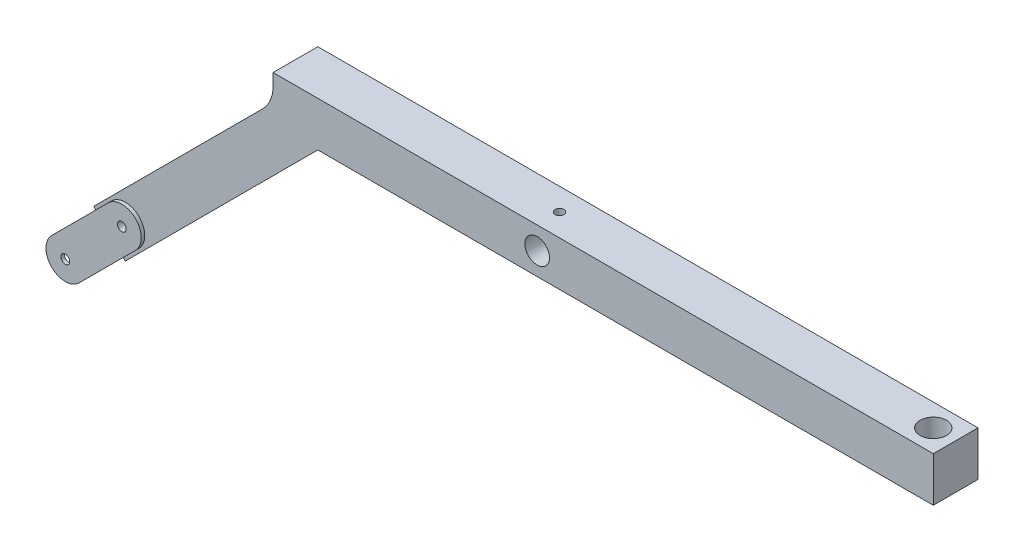
ISO-10303-21;
HEADER;
FILE_DESCRIPTION(('STEP AP214'),'2;1');
FILE_NAME('part.step','',(''),(''),'','','');
FILE_SCHEMA(('AUTOMOTIVE_DESIGN { 1 0 10303 214 1 1 1 1 }'));
ENDSEC;
DATA;
#1=APPLICATION_CONTEXT('core data for automotive mechanical design processes');
#2=APPLICATION_PROTOCOL_DEFINITION('international standard','automotive_design',2000,#1);
#3=PRODUCT_CONTEXT('',#1,'mechanical');
#4=PRODUCT('Part','Part','',(#3));
#5=PRODUCT_RELATED_PRODUCT_CATEGORY('part','',(#4));
#6=PRODUCT_DEFINITION_FORMATION('','',#4);
#7=PRODUCT_DEFINITION_CONTEXT('part definition',#1,'design');
#8=PRODUCT_DEFINITION('design','',#6,#7);
#9=PRODUCT_DEFINITION_SHAPE('','',#8);
#10=(LENGTH_UNIT() NAMED_UNIT(*) SI_UNIT(.MILLI.,.METRE.));
#11=(NAMED_UNIT(*) PLANE_ANGLE_UNIT() SI_UNIT($,.RADIAN.));
#12=(NAMED_UNIT(*) SI_UNIT($,.STERADIAN.) SOLID_ANGLE_UNIT());
#13=UNCERTAINTY_MEASURE_WITH_UNIT(LENGTH_MEASURE(1.E-05),#10,'distance_accuracy_value','');
#14=(GEOMETRIC_REPRESENTATION_CONTEXT(3) GLOBAL_UNCERTAINTY_ASSIGNED_CONTEXT((#13)) GLOBAL_UNIT_ASSIGNED_CONTEXT((#10,
#11,#12)) REPRESENTATION_CONTEXT('',''));
#15=CARTESIAN_POINT('',(0.,0.,0.));
#16=DIRECTION('',(0.,0.,1.));
#17=DIRECTION('',(1.,0.,0.));
#18=AXIS2_PLACEMENT_3D('',#15,#16,#17);
#19=CARTESIAN_POINT('',(-100.,0.,140.));
#20=DIRECTION('',(0.,0.,-1.));
#21=DIRECTION('',(-1.,0.,0.));
#22=AXIS2_PLACEMENT_3D('',#19,#20,#21);
#23=PLANE('',#22);
#24=DIRECTION('',(1.,0.,0.));
#25=VECTOR('',#24,1.);
#26=CARTESIAN_POINT('',(-100.,133.1,140.));
#27=LINE('',#26,#25);
#28=CARTESIAN_POINT('',(-100.,133.1,140.));
#29=VERTEX_POINT('',#28);
#30=CARTESIAN_POINT('',(275.,133.1,140.));
#31=VERTEX_POINT('',#30);
#32=EDGE_CURVE('E391',#29,#31,#27,.T.);
#33=ORIENTED_EDGE('',*,*,#32,.T.);
#34=DIRECTION('',(0.,1.,0.));
#35=VECTOR('',#34,1.);
#36=CARTESIAN_POINT('',(275.,133.1,140.));
#37=LINE('',#36,#35);
#38=CARTESIAN_POINT('',(275.,107.7,140.));
#39=VERTEX_POINT('',#38);
#40=EDGE_CURVE('E191',#39,#31,#37,.T.);
#41=ORIENTED_EDGE('',*,*,#40,.F.);
#42=DIRECTION('',(1.,0.,0.));
#43=VECTOR('',#42,1.);
#44=CARTESIAN_POINT('',(-100.,107.7,140.));
#45=LINE('',#44,#43);
#46=CARTESIAN_POINT('',(-74.6,107.7,140.));
#47=VERTEX_POINT('',#46);
#48=EDGE_CURVE('E186',#47,#39,#45,.T.);
#49=ORIENTED_EDGE('',*,*,#48,.F.);
#50=DIRECTION('',(0.707106781186547,0.707106781186548,0.));
#51=VECTOR('',#50,1.);
#52=CARTESIAN_POINT('',(-183.91870837144,-1.61870837144028,140.));
#53=LINE('',#52,#51);
#54=CARTESIAN_POINT('',(-183.91870837144,-1.61870837144028,140.));
#55=VERTEX_POINT('',#54);
#56=EDGE_CURVE('E346',#55,#47,#53,.T.);
#57=ORIENTED_EDGE('',*,*,#56,.F.);
#58=DIRECTION('',(0.707106781186547,-0.707106781186548,0.));
#59=VECTOR('',#58,1.);
#60=CARTESIAN_POINT('',(-183.91870837144,-1.61870837144028,140.));
#61=LINE('',#60,#59);
#62=CARTESIAN_POINT('',(-185.120789899457,-0.416626843423315,140.));
#63=VERTEX_POINT('',#62);
#64=EDGE_CURVE('E341',#63,#55,#61,.T.);
#65=ORIENTED_EDGE('',*,*,#64,.F.);
#66=DIRECTION('',(0.707106781186548,0.707106781186548,0.));
#67=VECTOR('',#66,1.);
#68=CARTESIAN_POINT('',(-176.140533778388,8.56362927764567,140.));
#69=LINE('',#68,#67);
#70=CARTESIAN_POINT('',(-176.140533778388,8.56362927764567,140.));
#71=VERTEX_POINT('',#70);
#72=EDGE_CURVE('E249',#63,#71,#69,.T.);
#73=ORIENTED_EDGE('',*,*,#72,.T.);
#74=CARTESIAN_POINT('',(-183.91870837144,16.3418038706977,140.));
#75=DIRECTION('',(0.,0.,1.));
#76=DIRECTION('',(1.,0.,0.));
#77=AXIS2_PLACEMENT_3D('',#74,#75,#76);
#78=CIRCLE('',#77,11.);
#79=CARTESIAN_POINT('',(-191.696882964492,24.1199784637497,140.));
#80=VERTEX_POINT('',#79);
#81=EDGE_CURVE('E222',#71,#80,#78,.T.);
#82=ORIENTED_EDGE('',*,*,#81,.T.);
#83=DIRECTION('',(-0.707106781186548,-0.707106781186548,0.));
#84=VECTOR('',#83,1.);
#85=CARTESIAN_POINT('',(-191.696882964492,24.1199784637497,140.));
#86=LINE('',#85,#84);
#87=CARTESIAN_POINT('',(-200.677139085561,15.1397223426807,140.));
#88=VERTEX_POINT('',#87);
#89=EDGE_CURVE('E228',#80,#88,#86,.T.);
#90=ORIENTED_EDGE('',*,*,#89,.T.);
#91=CARTESIAN_POINT('',(-201.879220613578,16.3418038706977,140.));
#92=VERTEX_POINT('',#91);
#93=EDGE_CURVE('E342',#92,#88,#61,.T.);
#94=ORIENTED_EDGE('',*,*,#93,.F.);
#95=DIRECTION('',(0.707106781186547,0.707106781186548,0.));
#96=VECTOR('',#95,1.);
#97=CARTESIAN_POINT('',(-201.879220613578,16.3418038706977,140.));
#98=LINE('',#97,#96);
#99=CARTESIAN_POINT('',(-105.857864376269,112.363160108007,140.));
#100=VERTEX_POINT('',#99);
#101=EDGE_CURVE('E352',#92,#100,#98,.T.);
#102=ORIENTED_EDGE('',*,*,#101,.T.);
#103=CARTESIAN_POINT('',(-120.,126.505295731738,140.));
#104=DIRECTION('',(0.,0.,-1.));
#105=DIRECTION('',(-1.,0.,0.));
#106=AXIS2_PLACEMENT_3D('',#103,#104,#105);
#107=CIRCLE('',#106,20.);
#108=CARTESIAN_POINT('',(-100.,126.505295731738,140.));
#109=VERTEX_POINT('',#108);
#110=EDGE_CURVE('E52',#100,#109,#107,.F.);
#111=ORIENTED_EDGE('',*,*,#110,.T.);
#112=DIRECTION('',(0.,1.,0.));
#113=VECTOR('',#112,1.);
#114=CARTESIAN_POINT('',(-100.,0.,140.));
#115=LINE('',#114,#113);
#116=EDGE_CURVE('E374',#109,#29,#115,.T.);
#117=ORIENTED_EDGE('',*,*,#116,.T.);
#118=EDGE_LOOP('',(#33,#41,#49,#57,#65,#73,#82,#90,#94,#102,#111,#117));
#119=FACE_BOUND('',#118,.T.);
#120=CARTESIAN_POINT('',(49.9999999999997,120.4,140.));
#121=DIRECTION('',(0.,0.,-1.));
#122=DIRECTION('',(-1.,0.,0.));
#123=AXIS2_PLACEMENT_3D('',#120,#121,#122);
#124=CIRCLE('',#123,7.);
#125=CARTESIAN_POINT('',(42.9999999999997,120.4,140.));
#126=VERTEX_POINT('',#125);
#127=EDGE_CURVE('E375',#126,#126,#124,.F.);
#128=ORIENTED_EDGE('',*,*,#127,.T.);
#129=EDGE_LOOP('',(#128));
#130=FACE_BOUND('',#129,.T.);
#131=ADVANCED_FACE('F43',(#119,#130),#23,.T.);
#132=CARTESIAN_POINT('',(-100.,0.,165.4));
#133=DIRECTION('',(0.,0.,-1.));
#134=DIRECTION('',(-1.,0.,0.));
#135=AXIS2_PLACEMENT_3D('',#132,#133,#134);
#136=PLANE('',#135);
#137=CARTESIAN_POINT('',(49.9999999999997,120.4,165.4));
#138=DIRECTION('',(0.,0.,1.));
#139=DIRECTION('',(1.,0.,0.));
#140=AXIS2_PLACEMENT_3D('',#137,#138,#139);
#141=CIRCLE('',#140,7.);
#142=CARTESIAN_POINT('',(56.9999999999997,120.4,165.4));
#143=VERTEX_POINT('',#142);
#144=EDGE_CURVE('E370',#143,#143,#141,.T.);
#145=ORIENTED_EDGE('',*,*,#144,.F.);
#146=EDGE_LOOP('',(#145));
#147=FACE_BOUND('',#146,.T.);
#148=DIRECTION('',(1.,0.,0.));
#149=VECTOR('',#148,1.);
#150=CARTESIAN_POINT('',(-100.,107.7,165.4));
#151=LINE('',#150,#149);
#152=CARTESIAN_POINT('',(-74.6,107.7,165.4));
#153=VERTEX_POINT('',#152);
#154=CARTESIAN_POINT('',(275.,107.7,165.4));
#155=VERTEX_POINT('',#154);
#156=EDGE_CURVE('E167',#153,#155,#151,.T.);
#157=ORIENTED_EDGE('',*,*,#156,.T.);
#158=DIRECTION('',(0.,-1.,0.));
#159=VECTOR('',#158,1.);
#160=CARTESIAN_POINT('',(275.,133.1,165.4));
#161=LINE('',#160,#159);
#162=CARTESIAN_POINT('',(275.,133.1,165.4));
#163=VERTEX_POINT('',#162);
#164=EDGE_CURVE('E172',#163,#155,#161,.T.);
#165=ORIENTED_EDGE('',*,*,#164,.F.);
#166=DIRECTION('',(1.,0.,0.));
#167=VECTOR('',#166,1.);
#168=CARTESIAN_POINT('',(-100.,133.1,165.4));
#169=LINE('',#168,#167);
#170=CARTESIAN_POINT('',(-100.,133.1,165.4));
#171=VERTEX_POINT('',#170);
#172=EDGE_CURVE('E180',#171,#163,#169,.T.);
#173=ORIENTED_EDGE('',*,*,#172,.F.);
#174=DIRECTION('',(0.,1.,0.));
#175=VECTOR('',#174,1.);
#176=CARTESIAN_POINT('',(-100.,0.,165.4));
#177=LINE('',#176,#175);
#178=CARTESIAN_POINT('',(-100.,126.505295731738,165.4));
#179=VERTEX_POINT('',#178);
#180=EDGE_CURVE('E386',#179,#171,#177,.T.);
#181=ORIENTED_EDGE('',*,*,#180,.F.);
#182=CARTESIAN_POINT('',(-120.,126.505295731738,165.4));
#183=DIRECTION('',(0.,0.,-1.));
#184=DIRECTION('',(-1.,0.,0.));
#185=AXIS2_PLACEMENT_3D('',#182,#183,#184);
#186=CIRCLE('',#185,20.);
#187=CARTESIAN_POINT('',(-105.857864376269,112.363160108007,165.4));
#188=VERTEX_POINT('',#187);
#189=EDGE_CURVE('E11',#179,#188,#186,.T.);
#190=ORIENTED_EDGE('',*,*,#189,.T.);
#191=DIRECTION('',(0.707106781186547,0.707106781186548,0.));
#192=VECTOR('',#191,1.);
#193=CARTESIAN_POINT('',(-201.879220613578,16.3418038706977,165.4));
#194=LINE('',#193,#192);
#195=CARTESIAN_POINT('',(-201.879220613578,16.3418038706977,165.4));
#196=VERTEX_POINT('',#195);
#197=EDGE_CURVE('E355',#196,#188,#194,.T.);
#198=ORIENTED_EDGE('',*,*,#197,.F.);
#199=DIRECTION('',(-0.707106781186547,0.707106781186548,0.));
#200=VECTOR('',#199,1.);
#201=CARTESIAN_POINT('',(-183.91870837144,-1.61870837144028,165.4));
#202=LINE('',#201,#200);
#203=CARTESIAN_POINT('',(-200.677139085561,15.1397223426807,165.4));
#204=VERTEX_POINT('',#203);
#205=EDGE_CURVE('E332',#204,#196,#202,.T.);
#206=ORIENTED_EDGE('',*,*,#205,.F.);
#207=DIRECTION('',(-0.707106781186548,-0.707106781186548,0.));
#208=VECTOR('',#207,1.);
#209=CARTESIAN_POINT('',(-191.696882964492,24.1199784637497,165.4));
#210=LINE('',#209,#208);
#211=CARTESIAN_POINT('',(-191.696882964492,24.1199784637497,165.4));
#212=VERTEX_POINT('',#211);
#213=EDGE_CURVE('E302',#212,#204,#210,.T.);
#214=ORIENTED_EDGE('',*,*,#213,.F.);
#215=CARTESIAN_POINT('',(-183.91870837144,16.3418038706977,165.4));
#216=DIRECTION('',(0.,0.,1.));
#217=DIRECTION('',(1.,0.,0.));
#218=AXIS2_PLACEMENT_3D('',#215,#216,#217);
#219=CIRCLE('',#218,11.);
#220=CARTESIAN_POINT('',(-176.140533778388,8.56362927764567,165.4));
#221=VERTEX_POINT('',#220);
#222=EDGE_CURVE('E282',#221,#212,#219,.T.);
#223=ORIENTED_EDGE('',*,*,#222,.F.);
#224=DIRECTION('',(0.707106781186548,0.707106781186548,0.));
#225=VECTOR('',#224,1.);
#226=CARTESIAN_POINT('',(-176.140533778388,8.56362927764567,165.4));
#227=LINE('',#226,#225);
#228=CARTESIAN_POINT('',(-185.120789899457,-0.416626843423316,165.4));
#229=VERTEX_POINT('',#228);
#230=EDGE_CURVE('E179',#229,#221,#227,.T.);
#231=ORIENTED_EDGE('',*,*,#230,.F.);
#232=CARTESIAN_POINT('',(-183.91870837144,-1.61870837144028,165.4));
#233=VERTEX_POINT('',#232);
#234=EDGE_CURVE('E333',#233,#229,#202,.T.);
#235=ORIENTED_EDGE('',*,*,#234,.F.);
#236=DIRECTION('',(0.707106781186547,0.707106781186548,0.));
#237=VECTOR('',#236,1.);
#238=CARTESIAN_POINT('',(-183.91870837144,-1.61870837144028,165.4));
#239=LINE('',#238,#237);
#240=EDGE_CURVE('E174',#233,#153,#239,.T.);
#241=ORIENTED_EDGE('',*,*,#240,.T.);
#242=EDGE_LOOP('',(#157,#165,#173,#181,#190,#198,#206,#214,#223,#231,#235,#241));
#243=FACE_BOUND('',#242,.T.);
#244=ADVANCED_FACE('F169',(#147,#243),#136,.F.);
#245=CARTESIAN_POINT('',(-100.,107.7,0.));
#246=DIRECTION('',(0.,-1.,0.));
#247=DIRECTION('',(0.,0.,-1.));
#248=AXIS2_PLACEMENT_3D('',#245,#246,#247);
#249=PLANE('',#248);
#250=CARTESIAN_POINT('',(262.3,107.7,152.7));
#251=DIRECTION('',(0.,-1.,0.));
#252=DIRECTION('',(0.,0.,-1.));
#253=AXIS2_PLACEMENT_3D('',#250,#251,#252);
#254=CIRCLE('',#253,7.50000000000001);
#255=CARTESIAN_POINT('',(262.3,107.7,145.2));
#256=VERTEX_POINT('',#255);
#257=EDGE_CURVE('E202',#256,#256,#254,.F.);
#258=ORIENTED_EDGE('',*,*,#257,.T.);
#259=EDGE_LOOP('',(#258));
#260=FACE_BOUND('',#259,.T.);
#261=CARTESIAN_POINT('',(50.,107.7,152.7));
#262=DIRECTION('',(0.,1.,0.));
#263=DIRECTION('',(0.,0.,1.));
#264=AXIS2_PLACEMENT_3D('',#261,#262,#263);
#265=CIRCLE('',#264,2.5);
#266=CARTESIAN_POINT('',(50.,107.7,155.2));
#267=VERTEX_POINT('',#266);
#268=EDGE_CURVE('E362',#267,#267,#265,.T.);
#269=ORIENTED_EDGE('',*,*,#268,.T.);
#270=EDGE_LOOP('',(#269));
#271=FACE_BOUND('',#270,.T.);
#272=ORIENTED_EDGE('',*,*,#48,.T.);
#273=DIRECTION('',(0.,0.,-1.));
#274=VECTOR('',#273,1.);
#275=CARTESIAN_POINT('',(275.,107.7,165.4));
#276=LINE('',#275,#274);
#277=EDGE_CURVE('E183',#155,#39,#276,.T.);
#278=ORIENTED_EDGE('',*,*,#277,.F.);
#279=ORIENTED_EDGE('',*,*,#156,.F.);
#280=DIRECTION('',(0.,0.,1.));
#281=VECTOR('',#280,1.);
#282=CARTESIAN_POINT('',(-74.6,107.7,140.));
#283=LINE('',#282,#281);
#284=EDGE_CURVE('E327',#47,#153,#283,.T.);
#285=ORIENTED_EDGE('',*,*,#284,.F.);
#286=EDGE_LOOP('',(#272,#278,#279,#285));
#287=FACE_BOUND('',#286,.T.);
#288=ADVANCED_FACE('F184',(#260,#271,#287),#249,.T.);
#289=CARTESIAN_POINT('',(-100.,0.,0.));
#290=DIRECTION('',(1.,0.,0.));
#291=DIRECTION('',(0.,0.,-1.));
#292=AXIS2_PLACEMENT_3D('',#289,#290,#291);
#293=PLANE('',#292);
#294=ORIENTED_EDGE('',*,*,#116,.F.);
#295=DIRECTION('',(0.,0.,-1.));
#296=VECTOR('',#295,1.);
#297=CARTESIAN_POINT('',(-100.,126.505295731738,165.4));
#298=LINE('',#297,#296);
#299=EDGE_CURVE('E65',#109,#179,#298,.F.);
#300=ORIENTED_EDGE('',*,*,#299,.T.);
#301=ORIENTED_EDGE('',*,*,#180,.T.);
#302=DIRECTION('',(0.,0.,-1.));
#303=VECTOR('',#302,1.);
#304=CARTESIAN_POINT('',(-100.,133.1,0.));
#305=LINE('',#304,#303);
#306=EDGE_CURVE('E382',#171,#29,#305,.T.);
#307=ORIENTED_EDGE('',*,*,#306,.T.);
#308=EDGE_LOOP('',(#294,#300,#301,#307));
#309=FACE_BOUND('',#308,.T.);
#310=ADVANCED_FACE('F511',(#309),#293,.F.);
#311=CARTESIAN_POINT('',(-100.,133.1,0.));
#312=DIRECTION('',(0.,-1.,0.));
#313=DIRECTION('',(0.,0.,-1.));
#314=AXIS2_PLACEMENT_3D('',#311,#312,#313);
#315=PLANE('',#314);
#316=CARTESIAN_POINT('',(262.3,133.1,152.7));
#317=DIRECTION('',(0.,1.,0.));
#318=DIRECTION('',(0.,0.,1.));
#319=AXIS2_PLACEMENT_3D('',#316,#317,#318);
#320=CIRCLE('',#319,7.50000000000001);
#321=CARTESIAN_POINT('',(262.3,133.1,160.2));
#322=VERTEX_POINT('',#321);
#323=EDGE_CURVE('E198',#322,#322,#320,.T.);
#324=ORIENTED_EDGE('',*,*,#323,.F.);
#325=EDGE_LOOP('',(#324));
#326=FACE_BOUND('',#325,.T.);
#327=CARTESIAN_POINT('',(50.,133.1,152.7));
#328=DIRECTION('',(0.,1.,0.));
#329=DIRECTION('',(0.,0.,1.));
#330=AXIS2_PLACEMENT_3D('',#327,#328,#329);
#331=CIRCLE('',#330,2.5);
#332=CARTESIAN_POINT('',(50.,133.1,155.2));
#333=VERTEX_POINT('',#332);
#334=EDGE_CURVE('E361',#333,#333,#331,.T.);
#335=ORIENTED_EDGE('',*,*,#334,.F.);
#336=EDGE_LOOP('',(#335));
#337=FACE_BOUND('',#336,.T.);
#338=ORIENTED_EDGE('',*,*,#172,.T.);
#339=DIRECTION('',(0.,0.,1.));
#340=VECTOR('',#339,1.);
#341=CARTESIAN_POINT('',(275.,133.1,165.4));
#342=LINE('',#341,#340);
#343=EDGE_CURVE('E196',#31,#163,#342,.T.);
#344=ORIENTED_EDGE('',*,*,#343,.F.);
#345=ORIENTED_EDGE('',*,*,#32,.F.);
#346=ORIENTED_EDGE('',*,*,#306,.F.);
#347=EDGE_LOOP('',(#338,#344,#345,#346));
#348=FACE_BOUND('',#347,.T.);
#349=ADVANCED_FACE('F509',(#326,#337,#348),#315,.F.);
#350=CARTESIAN_POINT('',(49.9999999999997,120.4,-173.501));
#351=DIRECTION('',(0.,0.,1.));
#352=DIRECTION('',(1.,0.,0.));
#353=AXIS2_PLACEMENT_3D('',#350,#351,#352);
#354=CYLINDRICAL_SURFACE('',#353,7.);
#355=CARTESIAN_POINT('',(50.,113.4,155.2));
#356=CARTESIAN_POINT('',(49.8641602394813,113.39999797047,155.200002824042));
#357=CARTESIAN_POINT('',(49.7283405700525,113.403989433964,155.188893242767));
#358=CARTESIAN_POINT('',(49.4607351033931,113.419515950514,155.144908712808));
#359=CARTESIAN_POINT('',(49.3289491523854,113.431050715622,155.112034594935));
#360=CARTESIAN_POINT('',(49.0733078833257,113.46041890189,155.025814858733));
#361=CARTESIAN_POINT('',(48.9494386285408,113.478240872756,154.97250644028));
#362=CARTESIAN_POINT('',(48.712404147016,113.518389219676,154.847111280632));
#363=CARTESIAN_POINT('',(48.5992414935993,113.5407166746,154.775020040551));
#364=CARTESIAN_POINT('',(48.3824119719465,113.588526225702,154.611156867884));
#365=CARTESIAN_POINT('',(48.2792198432715,113.614091725549,154.518781268995));
#366=CARTESIAN_POINT('',(48.0894180067757,113.665064774637,154.31825363621));
#367=CARTESIAN_POINT('',(48.0028127129866,113.690472280098,154.210097416284));
#368=CARTESIAN_POINT('',(47.8457626443816,113.73919929831,153.976602207224));
#369=CARTESIAN_POINT('',(47.7759647020517,113.762418922382,153.850805256484));
#370=CARTESIAN_POINT('',(47.6587242777,113.802856475485,153.588296335296));
#371=CARTESIAN_POINT('',(47.6112738076845,113.820076548452,153.451588285432));
#372=CARTESIAN_POINT('',(47.5419086955147,113.845679617779,153.176577163798));
#373=CARTESIAN_POINT('',(47.5190948059267,113.85437266621,153.038530693057));
#374=CARTESIAN_POINT('',(47.4968384777252,113.862849381202,152.760316368176));
#375=CARTESIAN_POINT('',(47.4973875039403,113.862636301439,152.620149307458));
#376=CARTESIAN_POINT('',(47.5211492102767,113.853594117028,152.349644344948));
#377=CARTESIAN_POINT('',(47.5431483823635,113.845226363309,152.219181647));
#378=CARTESIAN_POINT('',(47.6071914894494,113.821579178256,151.963938472817));
#379=CARTESIAN_POINT('',(47.6492381626539,113.806298802769,151.839158775349));
#380=CARTESIAN_POINT('',(47.752904331559,113.770248295122,151.596226254214));
#381=CARTESIAN_POINT('',(47.8148580406674,113.749385522249,151.478230397341));
#382=CARTESIAN_POINT('',(47.9563472730931,113.704555303036,151.25394361335));
#383=CARTESIAN_POINT('',(48.0358884501977,113.680586859353,151.147656466693));
#384=CARTESIAN_POINT('',(48.2159685095289,113.630475015341,150.943040408629));
#385=CARTESIAN_POINT('',(48.3174866848456,113.604287765256,150.845582140751));
#386=CARTESIAN_POINT('',(48.5357381546509,113.553945263945,150.668828317165));
#387=CARTESIAN_POINT('',(48.6524733698063,113.52979026986,150.589535057701));
#388=CARTESIAN_POINT('',(48.8998996570783,113.48583001278,150.450519390061));
#389=CARTESIAN_POINT('',(49.0307508875748,113.466084678296,150.39106176011));
#390=CARTESIAN_POINT('',(49.3014765318728,113.433608323126,150.29528417584));
#391=CARTESIAN_POINT('',(49.4413473009462,113.420874488744,150.258954939237));
#392=CARTESIAN_POINT('',(49.7187949081862,113.404337973679,150.21208084934));
#393=CARTESIAN_POINT('',(49.8561493868309,113.400128960009,150.200361869254));
#394=CARTESIAN_POINT('',(50.1309093715734,113.399877021093,150.19965487801));
#395=CARTESIAN_POINT('',(50.2683148622127,113.403832481435,150.210662373008));
#396=CARTESIAN_POINT('',(50.5343686989978,113.419196500048,150.254186137322));
#397=CARTESIAN_POINT('',(50.6631558480814,113.430345821806,150.285954755798));
#398=CARTESIAN_POINT('',(50.91349944403,113.458717542033,150.369136594736));
#399=CARTESIAN_POINT('',(51.0350549497002,113.475940729001,150.420552365829));
#400=CARTESIAN_POINT('',(51.271317908515,113.515342604267,150.543158853402));
#401=CARTESIAN_POINT('',(51.3857354629872,113.537647375377,150.614866480499));
#402=CARTESIAN_POINT('',(51.6012793689737,113.584716044862,150.775427495107));
#403=CARTESIAN_POINT('',(51.7024011406396,113.609480785466,150.864286764774));
#404=CARTESIAN_POINT('',(51.8940229205975,113.660339590396,151.062129632729));
#405=CARTESIAN_POINT('',(51.9836868190697,113.686435201337,151.17192471302));
#406=CARTESIAN_POINT('',(52.143455257816,113.735721240023,151.405541270004));
#407=CARTESIAN_POINT('',(52.2135588430956,113.75891152589,151.529363431129));
#408=CARTESIAN_POINT('',(52.3320868609421,113.799596670434,151.788064809236));
#409=CARTESIAN_POINT('',(52.3804881075604,113.817085432405,151.92295567051));
#410=CARTESIAN_POINT('',(52.4536141901675,113.843985579958,152.19976010072));
#411=CARTESIAN_POINT('',(52.4783518546378,113.853401341781,152.341669820662));
#412=CARTESIAN_POINT('',(52.5023625550686,113.862544035722,152.619520479373));
#413=CARTESIAN_POINT('',(52.5030442697818,113.862806932435,152.755323214424));
#414=CARTESIAN_POINT('',(52.4824703500887,113.854966805362,153.024997670655));
#415=CARTESIAN_POINT('',(52.4612164224421,113.846864432458,153.158869541248));
#416=CARTESIAN_POINT('',(52.398430076072,113.823632995722,153.417500585372));
#417=CARTESIAN_POINT('',(52.3574196100894,113.80868525751,153.542404099006));
#418=CARTESIAN_POINT('',(52.2567264433817,113.773536706849,153.783642681867));
#419=CARTESIAN_POINT('',(52.197039249569,113.753334630554,153.899975680944));
#420=CARTESIAN_POINT('',(52.0573031307191,113.708727690052,154.126925749952));
#421=CARTESIAN_POINT('',(51.9764037159518,113.684165996631,154.236988040863));
#422=CARTESIAN_POINT('',(51.7979086301193,113.634195886717,154.442427504661));
#423=CARTESIAN_POINT('',(51.7003079103359,113.608787216062,154.537800220351));
#424=CARTESIAN_POINT('',(51.4856625233953,113.558545543323,154.715721902817));
#425=CARTESIAN_POINT('',(51.3679175061671,113.533796329292,154.797453039791));
#426=CARTESIAN_POINT('',(51.1195113124947,113.488950755982,154.939907663838));
#427=CARTESIAN_POINT('',(50.988851114159,113.468854044737,155.000632740203));
#428=CARTESIAN_POINT('',(50.717646336525,113.435539938192,155.099140310309));
#429=CARTESIAN_POINT('',(50.5770625604678,113.422351780261,155.136825408163));
#430=CARTESIAN_POINT('',(50.2909768811348,113.404584577224,155.187248874639));
#431=CARTESIAN_POINT('',(50.1454769190978,113.400002173515,155.199996975606));
#432=CARTESIAN_POINT('',(50.,113.4,155.2));
#433=B_SPLINE_CURVE_WITH_KNOTS('',3,(#355,#356,#357,#358,#359,#360,#361,#362,#363,#364,#365,
#366,#367,#368,#369,#370,#371,#372,#373,#374,#375,#376,#377,#378,#379,#380,#381,#382,#383,#384,
#385,#386,#387,#388,#389,#390,#391,#392,#393,#394,#395,#396,#397,#398,#399,#400,#401,#402,#403,
#404,#405,#406,#407,#408,#409,#410,#411,#412,#413,#414,#415,#416,#417,#418,#419,#420,#421,#422,
#423,#424,#425,#426,#427,#428,#429,#430,#431,#432),.UNSPECIFIED.,.T.,.F.,(4,2,2,2,2,2,2,2,2,2,2,
2,2,2,2,2,2,2,2,2,2,2,2,2,2,2,2,2,2,2,2,2,2,2,2,2,2,2,4),(0.,0.406983217142948,
0.813950899519918,1.22018120425628,1.62650889940496,2.04714572459518,2.46789433314933,
2.90289606780331,3.33774219500346,3.75611562378721,4.17433620956449,4.57019246497944,
4.96610280426152,5.36904149669466,5.77210990935865,6.19956653135136,6.62707715847136,
7.06008524763623,7.49291944485569,7.90458529912079,8.31616976000821,8.71369326802823,
9.11126840085788,9.52005856953121,9.9289891826931,10.3593838463852,10.7897995195909,
11.2206739431307,11.6513146487841,12.0566930957309,12.4620400035307,12.8572208236401,
13.2524967861626,13.6670344525245,14.0816976535746,14.5159343578492,14.9501382011315,
15.3861650682913,15.8220217300551),.UNSPECIFIED.);
#434=CARTESIAN_POINT('',(50.,113.4,155.2));
#435=VERTEX_POINT('',#434);
#436=EDGE_CURVE('E379',#435,#435,#433,.T.);
#437=ORIENTED_EDGE('',*,*,#436,.T.);
#438=EDGE_LOOP('',(#437));
#439=FACE_BOUND('',#438,.T.);
#440=CARTESIAN_POINT('',(50.,127.4,155.2));
#441=CARTESIAN_POINT('',(50.1358397605187,127.40000202953,155.200002824042));
#442=CARTESIAN_POINT('',(50.2716594299475,127.396010566036,155.188893242767));
#443=CARTESIAN_POINT('',(50.5392648966069,127.380484049486,155.144908712808));
#444=CARTESIAN_POINT('',(50.6710508476146,127.368949284377,155.112034594935));
#445=CARTESIAN_POINT('',(50.9266921166743,127.33958109811,155.025814858733));
#446=CARTESIAN_POINT('',(51.0505613714592,127.321759127243,154.97250644028));
#447=CARTESIAN_POINT('',(51.287595852984,127.281610780323,154.847111280632));
#448=CARTESIAN_POINT('',(51.4007585064008,127.2592833254,154.775020040551));
#449=CARTESIAN_POINT('',(51.6175880280535,127.211473774297,154.611156867884));
#450=CARTESIAN_POINT('',(51.7207801567285,127.185908274451,154.518781268995));
#451=CARTESIAN_POINT('',(51.9105819932243,127.134935225363,154.31825363621));
#452=CARTESIAN_POINT('',(51.9971872870135,127.109527719902,154.210097416284));
#453=CARTESIAN_POINT('',(52.1542373556184,127.06080070169,153.976602207224));
#454=CARTESIAN_POINT('',(52.2240352979483,127.037581077618,153.850805256483));
#455=CARTESIAN_POINT('',(52.3412757223001,126.997143524515,153.588296335296));
#456=CARTESIAN_POINT('',(52.3887261923155,126.979923451548,153.451588285432));
#457=CARTESIAN_POINT('',(52.4580913044853,126.95432038222,153.176577163797));
#458=CARTESIAN_POINT('',(52.4809051940733,126.94562733379,153.038530693057));
#459=CARTESIAN_POINT('',(52.5031615222748,126.937150618798,152.760316368176));
#460=CARTESIAN_POINT('',(52.5026124960597,126.937363698561,152.620149307458));
#461=CARTESIAN_POINT('',(52.4788507897233,126.946405882972,152.349644344948));
#462=CARTESIAN_POINT('',(52.4568516176365,126.95477363669,152.219181647));
#463=CARTESIAN_POINT('',(52.3928085105506,126.978420821744,151.963938472817));
#464=CARTESIAN_POINT('',(52.3507618373461,126.993701197231,151.839158775349));
#465=CARTESIAN_POINT('',(52.247095668441,127.029751704878,151.596226254214));
#466=CARTESIAN_POINT('',(52.1851419593326,127.05061447775,151.478230397342));
#467=CARTESIAN_POINT('',(52.043652726907,127.095444696964,151.25394361335));
#468=CARTESIAN_POINT('',(51.9641115498023,127.119413140647,151.147656466693));
#469=CARTESIAN_POINT('',(51.7840314904711,127.169524984659,150.943040408629));
#470=CARTESIAN_POINT('',(51.6825133151544,127.195712234743,150.845582140751));
#471=CARTESIAN_POINT('',(51.4642618453491,127.246054736055,150.668828317165));
#472=CARTESIAN_POINT('',(51.3475266301937,127.27020973014,150.589535057701));
#473=CARTESIAN_POINT('',(51.1001003429218,127.31416998722,150.450519390061));
#474=CARTESIAN_POINT('',(50.9692491124252,127.333915321704,150.39106176011));
#475=CARTESIAN_POINT('',(50.6985234681273,127.366391676874,150.29528417584));
#476=CARTESIAN_POINT('',(50.5586526990538,127.379125511256,150.258954939237));
#477=CARTESIAN_POINT('',(50.2812050918138,127.395662026321,150.21208084934));
#478=CARTESIAN_POINT('',(50.1438506131691,127.399871039991,150.200361869254));
#479=CARTESIAN_POINT('',(49.8690906284266,127.400122978907,150.19965487801));
#480=CARTESIAN_POINT('',(49.7316851377873,127.396167518565,150.210662373008));
#481=CARTESIAN_POINT('',(49.4656313010022,127.380803499952,150.254186137322));
#482=CARTESIAN_POINT('',(49.3368441519186,127.369654178194,150.285954755798));
#483=CARTESIAN_POINT('',(49.08650055597,127.341282457967,150.369136594736));
#484=CARTESIAN_POINT('',(48.9649450502998,127.324059270999,150.420552365829));
#485=CARTESIAN_POINT('',(48.728682091485,127.284657395733,150.543158853402));
#486=CARTESIAN_POINT('',(48.6142645370128,127.262352624623,150.614866480499));
#487=CARTESIAN_POINT('',(48.3987206310263,127.215283955138,150.775427495107));
#488=CARTESIAN_POINT('',(48.2975988593604,127.190519214535,150.864286764774));
#489=CARTESIAN_POINT('',(48.1059770794025,127.139660409605,151.062129632729));
#490=CARTESIAN_POINT('',(48.0163131809303,127.113564798663,151.17192471302));
#491=CARTESIAN_POINT('',(47.856544742184,127.064278759977,151.405541270004));
#492=CARTESIAN_POINT('',(47.7864411569044,127.04108847411,151.529363431129));
#493=CARTESIAN_POINT('',(47.6679131390579,127.000403329566,151.788064809236));
#494=CARTESIAN_POINT('',(47.6195118924396,126.982914567596,151.92295567051));
#495=CARTESIAN_POINT('',(47.5463858098325,126.956014420043,152.19976010072));
#496=CARTESIAN_POINT('',(47.5216481453622,126.946598658219,152.341669820662));
#497=CARTESIAN_POINT('',(47.4976374449314,126.937455964278,152.619520479373));
#498=CARTESIAN_POINT('',(47.4969557302182,126.937193067565,152.755323214424));
#499=CARTESIAN_POINT('',(47.5175296499113,126.945033194638,153.024997670655));
#500=CARTESIAN_POINT('',(47.5387835775579,126.953135567542,153.158869541248));
#501=CARTESIAN_POINT('',(47.6015699239281,126.976367004278,153.417500585372));
#502=CARTESIAN_POINT('',(47.6425803899107,126.99131474249,153.542404099006));
#503=CARTESIAN_POINT('',(47.7432735566183,127.026463293151,153.783642681867));
#504=CARTESIAN_POINT('',(47.8029607504311,127.046665369447,153.899975680944));
#505=CARTESIAN_POINT('',(47.942696869281,127.091272309948,154.126925749952));
#506=CARTESIAN_POINT('',(48.0235962840483,127.115834003369,154.236988040863));
#507=CARTESIAN_POINT('',(48.2020913698808,127.165804113283,154.442427504661));
#508=CARTESIAN_POINT('',(48.2996920896642,127.191212783939,154.537800220351));
#509=CARTESIAN_POINT('',(48.5143374766048,127.241454456677,154.715721902817));
#510=CARTESIAN_POINT('',(48.632082493833,127.266203670708,154.797453039791));
#511=CARTESIAN_POINT('',(48.8804886875054,127.311049244019,154.939907663838));
#512=CARTESIAN_POINT('',(49.0111488858411,127.331145955263,155.000632740203));
#513=CARTESIAN_POINT('',(49.2823536634751,127.364460061808,155.099140310309));
#514=CARTESIAN_POINT('',(49.4229374395322,127.377648219739,155.136825408163));
#515=CARTESIAN_POINT('',(49.7090231188652,127.395415422776,155.187248874639));
#516=CARTESIAN_POINT('',(49.8545230809022,127.399997826485,155.199996975606));
#517=CARTESIAN_POINT('',(50.,127.4,155.2));
#518=B_SPLINE_CURVE_WITH_KNOTS('',3,(#440,#441,#442,#443,#444,#445,#446,#447,#448,#449,#450,
#451,#452,#453,#454,#455,#456,#457,#458,#459,#460,#461,#462,#463,#464,#465,#466,#467,#468,#469,
#470,#471,#472,#473,#474,#475,#476,#477,#478,#479,#480,#481,#482,#483,#484,#485,#486,#487,#488,
#489,#490,#491,#492,#493,#494,#495,#496,#497,#498,#499,#500,#501,#502,#503,#504,#505,#506,#507,
#508,#509,#510,#511,#512,#513,#514,#515,#516,#517),.UNSPECIFIED.,.T.,.F.,(4,2,2,2,2,2,2,2,2,2,2,
2,2,2,2,2,2,2,2,2,2,2,2,2,2,2,2,2,2,2,2,2,2,2,2,2,2,2,4),(0.,0.406983217142955,0.81395089951995,
1.22018120425632,1.626508899405,2.04714572459524,2.46789433314943,2.90289606780342,
3.33774219500357,3.75611562378738,4.17433620956457,4.57019246497947,4.96610280426155,
5.36904149669468,5.77210990935869,6.1995665313514,6.62707715847141,7.06008524763629,
7.49291944485576,7.90458529912084,8.3161697600083,8.71369326802831,9.11126840085796,
9.52005856953127,9.92898918269318,10.3593838463852,10.7897995195909,11.2206739431308,
11.6513146487842,12.0566930957309,12.4620400035307,12.8572208236402,13.2524967861626,
13.6670344525246,14.0816976535747,14.5159343578493,14.9501382011316,15.3861650682914,
15.8220217300551),.UNSPECIFIED.);
#519=CARTESIAN_POINT('',(50.,127.4,155.2));
#520=VERTEX_POINT('',#519);
#521=EDGE_CURVE('E366',#520,#520,#518,.T.);
#522=ORIENTED_EDGE('',*,*,#521,.T.);
#523=EDGE_LOOP('',(#522));
#524=FACE_BOUND('',#523,.T.);
#525=ORIENTED_EDGE('',*,*,#127,.F.);
#526=EDGE_LOOP('',(#525));
#527=FACE_BOUND('',#526,.T.);
#528=ORIENTED_EDGE('',*,*,#144,.T.);
#529=EDGE_LOOP('',(#528));
#530=FACE_BOUND('',#529,.T.);
#531=ADVANCED_FACE('F408',(#439,#524,#527,#530),#354,.F.);
#532=CARTESIAN_POINT('',(50.,107.7,152.7));
#533=DIRECTION('',(0.,1.,0.));
#534=DIRECTION('',(0.,0.,1.));
#535=AXIS2_PLACEMENT_3D('',#532,#533,#534);
#536=CYLINDRICAL_SURFACE('',#535,2.5);
#537=ORIENTED_EDGE('',*,*,#334,.T.);
#538=EDGE_LOOP('',(#537));
#539=FACE_BOUND('',#538,.T.);
#540=ORIENTED_EDGE('',*,*,#521,.F.);
#541=EDGE_LOOP('',(#540));
#542=FACE_BOUND('',#541,.T.);
#543=ADVANCED_FACE('F416',(#539,#542),#536,.F.);
#544=ORIENTED_EDGE('',*,*,#268,.F.);
#545=EDGE_LOOP('',(#544));
#546=FACE_BOUND('',#545,.T.);
#547=ORIENTED_EDGE('',*,*,#436,.F.);
#548=EDGE_LOOP('',(#547));
#549=FACE_BOUND('',#548,.T.);
#550=ADVANCED_FACE('F411',(#546,#549),#536,.F.);
#551=CARTESIAN_POINT('',(-201.879220613578,16.3418038706977,140.));
#552=DIRECTION('',(0.707106781186548,-0.707106781186547,0.));
#553=DIRECTION('',(0.707106781186547,0.707106781186548,0.));
#554=AXIS2_PLACEMENT_3D('',#551,#552,#553);
#555=PLANE('',#554);
#556=ORIENTED_EDGE('',*,*,#197,.T.);
#557=DIRECTION('',(0.,0.,-1.));
#558=VECTOR('',#557,1.);
#559=CARTESIAN_POINT('',(-105.857864376269,112.363160108007,140.));
#560=LINE('',#559,#558);
#561=EDGE_CURVE('E551',#188,#100,#560,.T.);
#562=ORIENTED_EDGE('',*,*,#561,.T.);
#563=ORIENTED_EDGE('',*,*,#101,.F.);
#564=DIRECTION('',(0.,0.,-1.));
#565=VECTOR('',#564,1.);
#566=CARTESIAN_POINT('',(-201.879220613578,16.3418038706977,140.));
#567=LINE('',#566,#565);
#568=EDGE_CURVE('E337',#196,#92,#567,.T.);
#569=ORIENTED_EDGE('',*,*,#568,.F.);
#570=EDGE_LOOP('',(#556,#562,#563,#569));
#571=FACE_BOUND('',#570,.T.);
#572=ADVANCED_FACE('F415',(#571),#555,.F.);
#573=CARTESIAN_POINT('',(-183.91870837144,-1.61870837144028,140.));
#574=DIRECTION('',(-0.707106781186548,0.707106781186547,0.));
#575=DIRECTION('',(-0.707106781186547,-0.707106781186548,0.));
#576=AXIS2_PLACEMENT_3D('',#573,#574,#575);
#577=PLANE('',#576);
#578=ORIENTED_EDGE('',*,*,#284,.T.);
#579=ORIENTED_EDGE('',*,*,#240,.F.);
#580=DIRECTION('',(0.,0.,1.));
#581=VECTOR('',#580,1.);
#582=CARTESIAN_POINT('',(-183.91870837144,-1.61870837144028,140.));
#583=LINE('',#582,#581);
#584=EDGE_CURVE('E328',#55,#233,#583,.T.);
#585=ORIENTED_EDGE('',*,*,#584,.F.);
#586=ORIENTED_EDGE('',*,*,#56,.T.);
#587=EDGE_LOOP('',(#578,#579,#585,#586));
#588=FACE_BOUND('',#587,.T.);
#589=ADVANCED_FACE('F418',(#588),#577,.F.);
#590=CARTESIAN_POINT('',(-92.7687083714403,-92.7687083714404,0.));
#591=DIRECTION('',(-0.707106781186548,-0.707106781186547,0.));
#592=DIRECTION('',(0.707106781186547,-0.707106781186548,0.));
#593=AXIS2_PLACEMENT_3D('',#590,#591,#592);
#594=PLANE('',#593);
#595=ORIENTED_EDGE('',*,*,#584,.T.);
#596=ORIENTED_EDGE('',*,*,#234,.T.);
#597=EDGE_CURVE('E338',#229,#204,#202,.T.);
#598=ORIENTED_EDGE('',*,*,#597,.T.);
#599=ORIENTED_EDGE('',*,*,#205,.T.);
#600=ORIENTED_EDGE('',*,*,#568,.T.);
#601=ORIENTED_EDGE('',*,*,#93,.T.);
#602=EDGE_CURVE('E347',#88,#63,#61,.T.);
#603=ORIENTED_EDGE('',*,*,#602,.T.);
#604=ORIENTED_EDGE('',*,*,#64,.T.);
#605=EDGE_LOOP('',(#595,#596,#598,#599,#600,#601,#603,#604));
#606=FACE_BOUND('',#605,.T.);
#607=ADVANCED_FACE('F422',(#606),#594,.T.);
#608=CARTESIAN_POINT('',(-183.91870837144,16.3418038706977,138.));
#609=DIRECTION('',(0.,0.,1.));
#610=DIRECTION('',(1.,0.,0.));
#611=AXIS2_PLACEMENT_3D('',#608,#609,#610);
#612=CYLINDRICAL_SURFACE('',#611,2.5);
#613=CARTESIAN_POINT('',(-183.91870837144,16.3418038706977,167.4));
#614=DIRECTION('',(0.,0.,1.));
#615=DIRECTION('',(1.,0.,0.));
#616=AXIS2_PLACEMENT_3D('',#613,#614,#615);
#617=CIRCLE('',#616,2.5);
#618=CARTESIAN_POINT('',(-181.41870837144,16.3418038706977,167.4));
#619=VERTEX_POINT('',#618);
#620=EDGE_CURVE('E275',#619,#619,#617,.T.);
#621=ORIENTED_EDGE('',*,*,#620,.T.);
#622=EDGE_LOOP('',(#621));
#623=FACE_BOUND('',#622,.T.);
#624=CARTESIAN_POINT('',(-183.91870837144,16.3418038706977,138.));
#625=DIRECTION('',(0.,0.,1.));
#626=DIRECTION('',(1.,0.,0.));
#627=AXIS2_PLACEMENT_3D('',#624,#625,#626);
#628=CIRCLE('',#627,2.5);
#629=CARTESIAN_POINT('',(-181.41870837144,16.3418038706977,138.));
#630=VERTEX_POINT('',#629);
#631=EDGE_CURVE('E215',#630,#630,#628,.T.);
#632=ORIENTED_EDGE('',*,*,#631,.F.);
#633=EDGE_LOOP('',(#632));
#634=FACE_BOUND('',#633,.T.);
#635=ADVANCED_FACE('F429',(#623,#634),#612,.F.);
#636=CARTESIAN_POINT('',(-183.91870837144,16.3418038706977,167.4));
#637=DIRECTION('',(0.,0.,1.));
#638=DIRECTION('',(1.,0.,0.));
#639=AXIS2_PLACEMENT_3D('',#636,#637,#638);
#640=PLANE('',#639);
#641=ORIENTED_EDGE('',*,*,#620,.F.);
#642=EDGE_LOOP('',(#641));
#643=FACE_BOUND('',#642,.T.);
#644=CARTESIAN_POINT('',(-183.91870837144,16.3418038706977,167.4));
#645=DIRECTION('',(0.,0.,1.));
#646=DIRECTION('',(1.,0.,0.));
#647=AXIS2_PLACEMENT_3D('',#644,#645,#646);
#648=CIRCLE('',#647,11.);
#649=CARTESIAN_POINT('',(-176.140533778388,8.56362927764567,167.4));
#650=VERTEX_POINT('',#649);
#651=CARTESIAN_POINT('',(-191.696882964492,24.1199784637497,167.4));
#652=VERTEX_POINT('',#651);
#653=EDGE_CURVE('E283',#650,#652,#648,.T.);
#654=ORIENTED_EDGE('',*,*,#653,.T.);
#655=DIRECTION('',(-0.707106781186548,-0.707106781186548,0.));
#656=VECTOR('',#655,1.);
#657=CARTESIAN_POINT('',(-191.696882964492,24.1199784637497,167.4));
#658=LINE('',#657,#656);
#659=CARTESIAN_POINT('',(-223.799530830362,-7.98266940211954,167.4));
#660=VERTEX_POINT('',#659);
#661=EDGE_CURVE('E287',#652,#660,#658,.T.);
#662=ORIENTED_EDGE('',*,*,#661,.T.);
#663=CARTESIAN_POINT('',(-216.02135623731,-15.7608439951716,167.4));
#664=DIRECTION('',(0.,0.,1.));
#665=DIRECTION('',(1.,0.,0.));
#666=AXIS2_PLACEMENT_3D('',#663,#664,#665);
#667=CIRCLE('',#666,11.);
#668=CARTESIAN_POINT('',(-208.243181644257,-23.5390185882236,167.4));
#669=VERTEX_POINT('',#668);
#670=EDGE_CURVE('E291',#660,#669,#667,.T.);
#671=ORIENTED_EDGE('',*,*,#670,.T.);
#672=DIRECTION('',(0.707106781186548,0.707106781186548,0.));
#673=VECTOR('',#672,1.);
#674=CARTESIAN_POINT('',(-176.140533778388,8.56362927764567,167.4));
#675=LINE('',#674,#673);
#676=EDGE_CURVE('E294',#669,#650,#675,.T.);
#677=ORIENTED_EDGE('',*,*,#676,.T.);
#678=EDGE_LOOP('',(#654,#662,#671,#677));
#679=FACE_BOUND('',#678,.T.);
#680=CARTESIAN_POINT('',(-216.02135623731,-15.7608439951716,167.4));
#681=DIRECTION('',(0.,0.,1.));
#682=DIRECTION('',(1.,0.,0.));
#683=AXIS2_PLACEMENT_3D('',#680,#681,#682);
#684=CIRCLE('',#683,2.5);
#685=CARTESIAN_POINT('',(-213.52135623731,-15.7608439951716,167.4));
#686=VERTEX_POINT('',#685);
#687=EDGE_CURVE('E271',#686,#686,#684,.T.);
#688=ORIENTED_EDGE('',*,*,#687,.F.);
#689=EDGE_LOOP('',(#688));
#690=FACE_BOUND('',#689,.T.);
#691=ADVANCED_FACE('F433',(#643,#679,#690),#640,.T.);
#692=CARTESIAN_POINT('',(-183.91870837144,16.3418038706977,165.4));
#693=DIRECTION('',(0.,0.,1.));
#694=DIRECTION('',(1.,0.,0.));
#695=AXIS2_PLACEMENT_3D('',#692,#693,#694);
#696=PLANE('',#695);
#697=ORIENTED_EDGE('',*,*,#597,.F.);
#698=CARTESIAN_POINT('',(-208.243181644257,-23.5390185882236,165.4));
#699=VERTEX_POINT('',#698);
#700=EDGE_CURVE('E288',#699,#229,#227,.T.);
#701=ORIENTED_EDGE('',*,*,#700,.F.);
#702=CARTESIAN_POINT('',(-216.02135623731,-15.7608439951716,165.4));
#703=DIRECTION('',(0.,0.,1.));
#704=DIRECTION('',(1.,0.,0.));
#705=AXIS2_PLACEMENT_3D('',#702,#703,#704);
#706=CIRCLE('',#705,11.);
#707=CARTESIAN_POINT('',(-223.799530830362,-7.98266940211954,165.4));
#708=VERTEX_POINT('',#707);
#709=EDGE_CURVE('E306',#708,#699,#706,.T.);
#710=ORIENTED_EDGE('',*,*,#709,.F.);
#711=EDGE_CURVE('E301',#204,#708,#210,.T.);
#712=ORIENTED_EDGE('',*,*,#711,.F.);
#713=EDGE_LOOP('',(#697,#701,#710,#712));
#714=FACE_BOUND('',#713,.T.);
#715=CARTESIAN_POINT('',(-216.02135623731,-15.7608439951716,165.4));
#716=DIRECTION('',(0.,0.,1.));
#717=DIRECTION('',(1.,0.,0.));
#718=AXIS2_PLACEMENT_3D('',#715,#716,#717);
#719=CIRCLE('',#718,2.5);
#720=CARTESIAN_POINT('',(-213.52135623731,-15.7608439951716,165.4));
#721=VERTEX_POINT('',#720);
#722=EDGE_CURVE('E270',#721,#721,#719,.T.);
#723=ORIENTED_EDGE('',*,*,#722,.T.);
#724=EDGE_LOOP('',(#723));
#725=FACE_BOUND('',#724,.T.);
#726=ADVANCED_FACE('F439',(#714,#725),#696,.F.);
#727=CARTESIAN_POINT('',(-183.91870837144,16.3418038706977,167.4));
#728=DIRECTION('',(0.,0.,-1.));
#729=DIRECTION('',(-1.,0.,0.));
#730=AXIS2_PLACEMENT_3D('',#727,#728,#729);
#731=CYLINDRICAL_SURFACE('',#730,11.);
#732=ORIENTED_EDGE('',*,*,#222,.T.);
#733=DIRECTION('',(0.,0.,-1.));
#734=VECTOR('',#733,1.);
#735=CARTESIAN_POINT('',(-191.696882964492,24.1199784637497,167.4));
#736=LINE('',#735,#734);
#737=EDGE_CURVE('E323',#652,#212,#736,.T.);
#738=ORIENTED_EDGE('',*,*,#737,.F.);
#739=ORIENTED_EDGE('',*,*,#653,.F.);
#740=DIRECTION('',(0.,0.,-1.));
#741=VECTOR('',#740,1.);
#742=CARTESIAN_POINT('',(-176.140533778388,8.56362927764567,167.4));
#743=LINE('',#742,#741);
#744=EDGE_CURVE('E297',#650,#221,#743,.T.);
#745=ORIENTED_EDGE('',*,*,#744,.T.);
#746=EDGE_LOOP('',(#732,#738,#739,#745));
#747=FACE_BOUND('',#746,.T.);
#748=ADVANCED_FACE('F435',(#747),#731,.T.);
#749=CARTESIAN_POINT('',(-191.696882964492,24.1199784637497,167.4));
#750=DIRECTION('',(0.707106781186547,-0.707106781186547,0.));
#751=DIRECTION('',(0.707106781186548,0.707106781186548,0.));
#752=AXIS2_PLACEMENT_3D('',#749,#750,#751);
#753=PLANE('',#752);
#754=ORIENTED_EDGE('',*,*,#213,.T.);
#755=ORIENTED_EDGE('',*,*,#711,.T.);
#756=DIRECTION('',(0.,0.,-1.));
#757=VECTOR('',#756,1.);
#758=CARTESIAN_POINT('',(-223.799530830362,-7.98266940211954,167.4));
#759=LINE('',#758,#757);
#760=EDGE_CURVE('E319',#660,#708,#759,.T.);
#761=ORIENTED_EDGE('',*,*,#760,.F.);
#762=ORIENTED_EDGE('',*,*,#661,.F.);
#763=ORIENTED_EDGE('',*,*,#737,.T.);
#764=EDGE_LOOP('',(#754,#755,#761,#762,#763));
#765=FACE_BOUND('',#764,.T.);
#766=ADVANCED_FACE('F438',(#765),#753,.F.);
#767=CARTESIAN_POINT('',(-216.02135623731,-15.7608439951716,167.4));
#768=DIRECTION('',(0.,0.,-1.));
#769=DIRECTION('',(-1.,0.,0.));
#770=AXIS2_PLACEMENT_3D('',#767,#768,#769);
#771=CYLINDRICAL_SURFACE('',#770,11.);
#772=ORIENTED_EDGE('',*,*,#709,.T.);
#773=DIRECTION('',(0.,0.,-1.));
#774=VECTOR('',#773,1.);
#775=CARTESIAN_POINT('',(-208.243181644257,-23.5390185882236,167.4));
#776=LINE('',#775,#774);
#777=EDGE_CURVE('E315',#669,#699,#776,.T.);
#778=ORIENTED_EDGE('',*,*,#777,.F.);
#779=ORIENTED_EDGE('',*,*,#670,.F.);
#780=ORIENTED_EDGE('',*,*,#760,.T.);
#781=EDGE_LOOP('',(#772,#778,#779,#780));
#782=FACE_BOUND('',#781,.T.);
#783=ADVANCED_FACE('F443',(#782),#771,.T.);
#784=CARTESIAN_POINT('',(-176.140533778388,8.56362927764567,167.4));
#785=DIRECTION('',(-0.707106781186547,0.707106781186547,0.));
#786=DIRECTION('',(-0.707106781186548,-0.707106781186548,0.));
#787=AXIS2_PLACEMENT_3D('',#784,#785,#786);
#788=PLANE('',#787);
#789=ORIENTED_EDGE('',*,*,#700,.T.);
#790=ORIENTED_EDGE('',*,*,#230,.T.);
#791=ORIENTED_EDGE('',*,*,#744,.F.);
#792=ORIENTED_EDGE('',*,*,#676,.F.);
#793=ORIENTED_EDGE('',*,*,#777,.T.);
#794=EDGE_LOOP('',(#789,#790,#791,#792,#793));
#795=FACE_BOUND('',#794,.T.);
#796=ADVANCED_FACE('F447',(#795),#788,.F.);
#797=CARTESIAN_POINT('',(-216.02135623731,-15.7608439951716,167.4));
#798=DIRECTION('',(0.,0.,-1.));
#799=DIRECTION('',(-1.,0.,0.));
#800=AXIS2_PLACEMENT_3D('',#797,#798,#799);
#801=CYLINDRICAL_SURFACE('',#800,2.5);
#802=ORIENTED_EDGE('',*,*,#687,.T.);
#803=EDGE_LOOP('',(#802));
#804=FACE_BOUND('',#803,.T.);
#805=ORIENTED_EDGE('',*,*,#722,.F.);
#806=EDGE_LOOP('',(#805));
#807=FACE_BOUND('',#806,.T.);
#808=ADVANCED_FACE('F451',(#804,#807),#801,.F.);
#809=CARTESIAN_POINT('',(-183.91870837144,16.3418038706977,138.));
#810=DIRECTION('',(0.,0.,1.));
#811=DIRECTION('',(1.,0.,0.));
#812=AXIS2_PLACEMENT_3D('',#809,#810,#811);
#813=CYLINDRICAL_SURFACE('',#812,11.);
#814=ORIENTED_EDGE('',*,*,#81,.F.);
#815=DIRECTION('',(0.,0.,1.));
#816=VECTOR('',#815,1.);
#817=CARTESIAN_POINT('',(-176.140533778388,8.56362927764567,138.));
#818=LINE('',#817,#816);
#819=CARTESIAN_POINT('',(-176.140533778388,8.56362927764567,138.));
#820=VERTEX_POINT('',#819);
#821=EDGE_CURVE('E266',#820,#71,#818,.T.);
#822=ORIENTED_EDGE('',*,*,#821,.F.);
#823=CARTESIAN_POINT('',(-183.91870837144,16.3418038706977,138.));
#824=DIRECTION('',(0.,0.,1.));
#825=DIRECTION('',(1.,0.,0.));
#826=AXIS2_PLACEMENT_3D('',#823,#824,#825);
#827=CIRCLE('',#826,11.);
#828=CARTESIAN_POINT('',(-191.696882964492,24.1199784637497,138.));
#829=VERTEX_POINT('',#828);
#830=EDGE_CURVE('E223',#820,#829,#827,.T.);
#831=ORIENTED_EDGE('',*,*,#830,.T.);
#832=DIRECTION('',(0.,0.,1.));
#833=VECTOR('',#832,1.);
#834=CARTESIAN_POINT('',(-191.696882964492,24.1199784637497,138.));
#835=LINE('',#834,#833);
#836=EDGE_CURVE('E240',#829,#80,#835,.T.);
#837=ORIENTED_EDGE('',*,*,#836,.T.);
#838=EDGE_LOOP('',(#814,#822,#831,#837));
#839=FACE_BOUND('',#838,.T.);
#840=ADVANCED_FACE('F461',(#839),#813,.T.);
#841=CARTESIAN_POINT('',(-176.140533778388,8.56362927764567,138.));
#842=DIRECTION('',(0.707106781186547,-0.707106781186547,0.));
#843=DIRECTION('',(0.707106781186548,0.707106781186548,0.));
#844=AXIS2_PLACEMENT_3D('',#841,#842,#843);
#845=PLANE('',#844);
#846=CARTESIAN_POINT('',(-208.243181644257,-23.5390185882236,140.));
#847=VERTEX_POINT('',#846);
#848=EDGE_CURVE('E244',#847,#63,#69,.T.);
#849=ORIENTED_EDGE('',*,*,#848,.F.);
#850=DIRECTION('',(0.,0.,1.));
#851=VECTOR('',#850,1.);
#852=CARTESIAN_POINT('',(-208.243181644257,-23.5390185882236,138.));
#853=LINE('',#852,#851);
#854=CARTESIAN_POINT('',(-208.243181644257,-23.5390185882236,138.));
#855=VERTEX_POINT('',#854);
#856=EDGE_CURVE('E263',#855,#847,#853,.T.);
#857=ORIENTED_EDGE('',*,*,#856,.F.);
#858=DIRECTION('',(0.707106781186548,0.707106781186548,0.));
#859=VECTOR('',#858,1.);
#860=CARTESIAN_POINT('',(-176.140533778388,8.56362927764567,138.));
#861=LINE('',#860,#859);
#862=EDGE_CURVE('E227',#855,#820,#861,.T.);
#863=ORIENTED_EDGE('',*,*,#862,.T.);
#864=ORIENTED_EDGE('',*,*,#821,.T.);
#865=ORIENTED_EDGE('',*,*,#72,.F.);
#866=EDGE_LOOP('',(#849,#857,#863,#864,#865));
#867=FACE_BOUND('',#866,.T.);
#868=ADVANCED_FACE('F465',(#867),#845,.T.);
#869=CARTESIAN_POINT('',(-216.02135623731,-15.7608439951716,138.));
#870=DIRECTION('',(0.,0.,1.));
#871=DIRECTION('',(1.,0.,0.));
#872=AXIS2_PLACEMENT_3D('',#869,#870,#871);
#873=CYLINDRICAL_SURFACE('',#872,11.);
#874=CARTESIAN_POINT('',(-216.02135623731,-15.7608439951716,140.));
#875=DIRECTION('',(0.,0.,1.));
#876=DIRECTION('',(1.,0.,0.));
#877=AXIS2_PLACEMENT_3D('',#874,#875,#876);
#878=CIRCLE('',#877,11.);
#879=CARTESIAN_POINT('',(-223.799530830362,-7.98266940211954,140.));
#880=VERTEX_POINT('',#879);
#881=EDGE_CURVE('E248',#880,#847,#878,.T.);
#882=ORIENTED_EDGE('',*,*,#881,.F.);
#883=DIRECTION('',(0.,0.,1.));
#884=VECTOR('',#883,1.);
#885=CARTESIAN_POINT('',(-223.799530830362,-7.98266940211954,138.));
#886=LINE('',#885,#884);
#887=CARTESIAN_POINT('',(-223.799530830362,-7.98266940211954,138.));
#888=VERTEX_POINT('',#887);
#889=EDGE_CURVE('E259',#888,#880,#886,.T.);
#890=ORIENTED_EDGE('',*,*,#889,.F.);
#891=CARTESIAN_POINT('',(-216.02135623731,-15.7608439951716,138.));
#892=DIRECTION('',(0.,0.,1.));
#893=DIRECTION('',(1.,0.,0.));
#894=AXIS2_PLACEMENT_3D('',#891,#892,#893);
#895=CIRCLE('',#894,11.);
#896=EDGE_CURVE('E232',#888,#855,#895,.T.);
#897=ORIENTED_EDGE('',*,*,#896,.T.);
#898=ORIENTED_EDGE('',*,*,#856,.T.);
#899=EDGE_LOOP('',(#882,#890,#897,#898));
#900=FACE_BOUND('',#899,.T.);
#901=ADVANCED_FACE('F469',(#900),#873,.T.);
#902=CARTESIAN_POINT('',(-191.696882964492,24.1199784637497,138.));
#903=DIRECTION('',(-0.707106781186547,0.707106781186547,0.));
#904=DIRECTION('',(-0.707106781186548,-0.707106781186548,0.));
#905=AXIS2_PLACEMENT_3D('',#902,#903,#904);
#906=PLANE('',#905);
#907=ORIENTED_EDGE('',*,*,#89,.F.);
#908=ORIENTED_EDGE('',*,*,#836,.F.);
#909=DIRECTION('',(-0.707106781186548,-0.707106781186548,0.));
#910=VECTOR('',#909,1.);
#911=CARTESIAN_POINT('',(-191.696882964492,24.1199784637497,138.));
#912=LINE('',#911,#910);
#913=EDGE_CURVE('E236',#829,#888,#912,.T.);
#914=ORIENTED_EDGE('',*,*,#913,.T.);
#915=ORIENTED_EDGE('',*,*,#889,.T.);
#916=EDGE_CURVE('E253',#88,#880,#86,.T.);
#917=ORIENTED_EDGE('',*,*,#916,.F.);
#918=EDGE_LOOP('',(#907,#908,#914,#915,#917));
#919=FACE_BOUND('',#918,.T.);
#920=ADVANCED_FACE('F473',(#919),#906,.T.);
#921=CARTESIAN_POINT('',(-183.91870837144,16.3418038706977,138.));
#922=DIRECTION('',(0.,0.,-1.));
#923=DIRECTION('',(1.,0.,0.));
#924=AXIS2_PLACEMENT_3D('',#921,#922,#923);
#925=PLANE('',#924);
#926=CARTESIAN_POINT('',(-216.02135623731,-15.7608439951716,138.));
#927=DIRECTION('',(0.,0.,1.));
#928=DIRECTION('',(1.,0.,0.));
#929=AXIS2_PLACEMENT_3D('',#926,#927,#928);
#930=CIRCLE('',#929,2.5);
#931=CARTESIAN_POINT('',(-213.52135623731,-15.7608439951716,138.));
#932=VERTEX_POINT('',#931);
#933=EDGE_CURVE('E211',#932,#932,#930,.T.);
#934=ORIENTED_EDGE('',*,*,#933,.T.);
#935=EDGE_LOOP('',(#934));
#936=FACE_BOUND('',#935,.T.);
#937=ORIENTED_EDGE('',*,*,#631,.T.);
#938=EDGE_LOOP('',(#937));
#939=FACE_BOUND('',#938,.T.);
#940=ORIENTED_EDGE('',*,*,#830,.F.);
#941=ORIENTED_EDGE('',*,*,#862,.F.);
#942=ORIENTED_EDGE('',*,*,#896,.F.);
#943=ORIENTED_EDGE('',*,*,#913,.F.);
#944=EDGE_LOOP('',(#940,#941,#942,#943));
#945=FACE_BOUND('',#944,.T.);
#946=ADVANCED_FACE('F477',(#936,#939,#945),#925,.T.);
#947=CARTESIAN_POINT('',(-183.91870837144,16.3418038706977,140.));
#948=DIRECTION('',(0.,0.,-1.));
#949=DIRECTION('',(1.,0.,0.));
#950=AXIS2_PLACEMENT_3D('',#947,#948,#949);
#951=PLANE('',#950);
#952=ORIENTED_EDGE('',*,*,#602,.F.);
#953=ORIENTED_EDGE('',*,*,#916,.T.);
#954=ORIENTED_EDGE('',*,*,#881,.T.);
#955=ORIENTED_EDGE('',*,*,#848,.T.);
#956=EDGE_LOOP('',(#952,#953,#954,#955));
#957=FACE_BOUND('',#956,.T.);
#958=CARTESIAN_POINT('',(-216.02135623731,-15.7608439951716,140.));
#959=DIRECTION('',(0.,0.,1.));
#960=DIRECTION('',(1.,0.,0.));
#961=AXIS2_PLACEMENT_3D('',#958,#959,#960);
#962=CIRCLE('',#961,2.5);
#963=CARTESIAN_POINT('',(-213.52135623731,-15.7608439951716,140.));
#964=VERTEX_POINT('',#963);
#965=EDGE_CURVE('E210',#964,#964,#962,.T.);
#966=ORIENTED_EDGE('',*,*,#965,.F.);
#967=EDGE_LOOP('',(#966));
#968=FACE_BOUND('',#967,.T.);
#969=ADVANCED_FACE('F479',(#957,#968),#951,.F.);
#970=CARTESIAN_POINT('',(-216.02135623731,-15.7608439951716,138.));
#971=DIRECTION('',(0.,0.,1.));
#972=DIRECTION('',(1.,0.,0.));
#973=AXIS2_PLACEMENT_3D('',#970,#971,#972);
#974=CYLINDRICAL_SURFACE('',#973,2.5);
#975=ORIENTED_EDGE('',*,*,#933,.F.);
#976=EDGE_LOOP('',(#975));
#977=FACE_BOUND('',#976,.T.);
#978=ORIENTED_EDGE('',*,*,#965,.T.);
#979=EDGE_LOOP('',(#978));
#980=FACE_BOUND('',#979,.T.);
#981=ADVANCED_FACE('F482',(#977,#980),#974,.F.);
#982=CARTESIAN_POINT('',(-120.,126.505295731738,140.));
#983=DIRECTION('',(0.,0.,1.));
#984=DIRECTION('',(1.,0.,0.));
#985=AXIS2_PLACEMENT_3D('',#982,#983,#984);
#986=CYLINDRICAL_SURFACE('',#985,20.);
#987=ORIENTED_EDGE('',*,*,#189,.F.);
#988=ORIENTED_EDGE('',*,*,#299,.F.);
#989=ORIENTED_EDGE('',*,*,#110,.F.);
#990=ORIENTED_EDGE('',*,*,#561,.F.);
#991=EDGE_LOOP('',(#987,#988,#989,#990));
#992=FACE_BOUND('',#991,.T.);
#993=ADVANCED_FACE('F45',(#992),#986,.F.);
#994=CARTESIAN_POINT('',(275.,0.,0.));
#995=DIRECTION('',(1.,0.,0.));
#996=DIRECTION('',(0.,0.,-1.));
#997=AXIS2_PLACEMENT_3D('',#994,#995,#996);
#998=PLANE('',#997);
#999=ORIENTED_EDGE('',*,*,#164,.T.);
#1000=ORIENTED_EDGE('',*,*,#277,.T.);
#1001=ORIENTED_EDGE('',*,*,#40,.T.);
#1002=ORIENTED_EDGE('',*,*,#343,.T.);
#1003=EDGE_LOOP('',(#999,#1000,#1001,#1002));
#1004=FACE_BOUND('',#1003,.T.);
#1005=ADVANCED_FACE('F194',(#1004),#998,.T.);
#1006=CARTESIAN_POINT('',(262.3,-26.7618439951716,152.7));
#1007=DIRECTION('',(0.,1.,0.));
#1008=DIRECTION('',(0.,0.,1.));
#1009=AXIS2_PLACEMENT_3D('',#1006,#1007,#1008);
#1010=CYLINDRICAL_SURFACE('',#1009,7.50000000000001);
#1011=ORIENTED_EDGE('',*,*,#257,.F.);
#1012=EDGE_LOOP('',(#1011));
#1013=FACE_BOUND('',#1012,.T.);
#1014=ORIENTED_EDGE('',*,*,#323,.T.);
#1015=EDGE_LOOP('',(#1014));
#1016=FACE_BOUND('',#1015,.T.);
#1017=ADVANCED_FACE('F492',(#1013,#1016),#1010,.F.);
#1018=CLOSED_SHELL('',(#131,#244,#288,#310,#349,#531,#543,#550,#572,#589,#607,#635,#691,#726,
#748,#766,#783,#796,#808,#840,#868,#901,#920,#946,#969,#981,#993,#1005,#1017));
#1019=MANIFOLD_SOLID_BREP('B2',#1018);
#1020=ADVANCED_BREP_SHAPE_REPRESENTATION('',(#18,#1019),#14);
#1021=SHAPE_DEFINITION_REPRESENTATION(#9,#1020);
ENDSEC;
END-ISO-10303-21;
